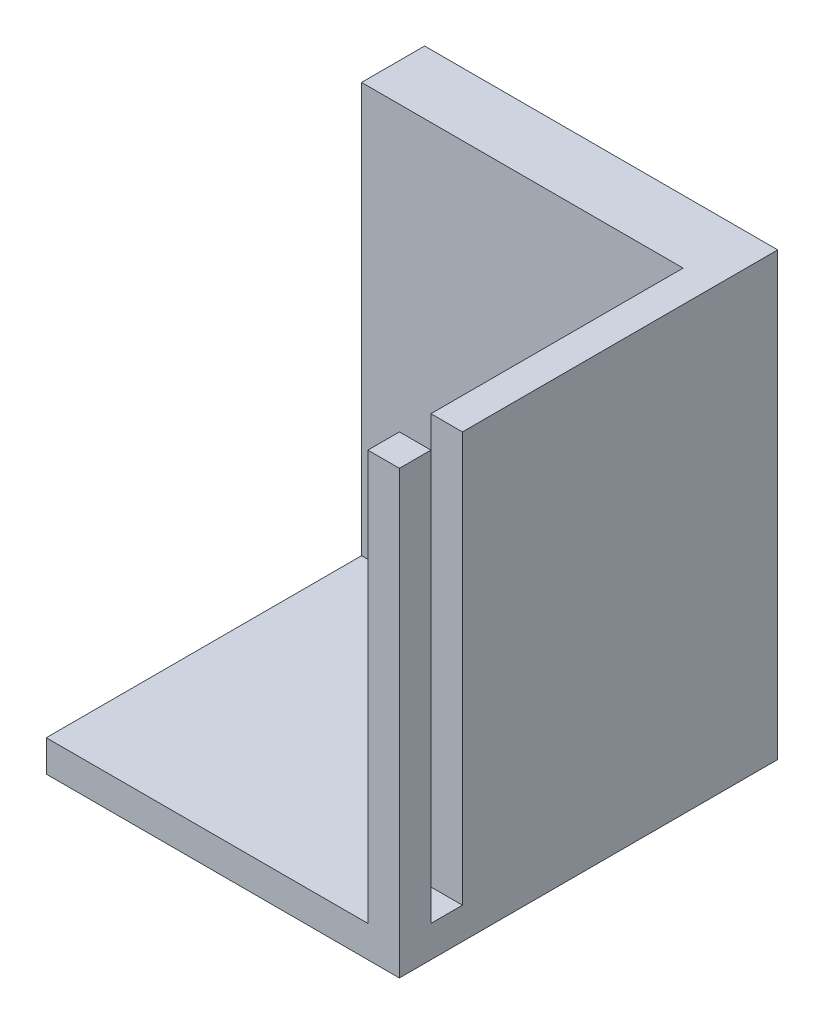
ISO-10303-21;
HEADER;
FILE_DESCRIPTION(('STEP AP214'),'2;1');
FILE_NAME('part.step','',(''),(''),'','','');
FILE_SCHEMA(('AUTOMOTIVE_DESIGN { 1 0 10303 214 1 1 1 1 }'));
ENDSEC;
DATA;
#1=APPLICATION_CONTEXT('core data for automotive mechanical design processes');
#2=APPLICATION_PROTOCOL_DEFINITION('international standard','automotive_design',2000,#1);
#3=PRODUCT_CONTEXT('',#1,'mechanical');
#4=PRODUCT('Part','Part','',(#3));
#5=PRODUCT_RELATED_PRODUCT_CATEGORY('part','',(#4));
#6=PRODUCT_DEFINITION_FORMATION('','',#4);
#7=PRODUCT_DEFINITION_CONTEXT('part definition',#1,'design');
#8=PRODUCT_DEFINITION('design','',#6,#7);
#9=PRODUCT_DEFINITION_SHAPE('','',#8);
#10=(LENGTH_UNIT() NAMED_UNIT(*) SI_UNIT(.MILLI.,.METRE.));
#11=(NAMED_UNIT(*) PLANE_ANGLE_UNIT() SI_UNIT($,.RADIAN.));
#12=(NAMED_UNIT(*) SI_UNIT($,.STERADIAN.) SOLID_ANGLE_UNIT());
#13=UNCERTAINTY_MEASURE_WITH_UNIT(LENGTH_MEASURE(1.E-05),#10,'distance_accuracy_value','');
#14=(GEOMETRIC_REPRESENTATION_CONTEXT(3) GLOBAL_UNCERTAINTY_ASSIGNED_CONTEXT((#13)) GLOBAL_UNIT_ASSIGNED_CONTEXT((#10,
#11,#12)) REPRESENTATION_CONTEXT('',''));
#15=CARTESIAN_POINT('',(0.,0.,0.));
#16=DIRECTION('',(0.,0.,1.));
#17=DIRECTION('',(1.,0.,0.));
#18=AXIS2_PLACEMENT_3D('',#15,#16,#17);
#19=CARTESIAN_POINT('',(0.,530.,0.));
#20=DIRECTION('',(0.,0.,-1.));
#21=DIRECTION('',(-1.,0.,0.));
#22=AXIS2_PLACEMENT_3D('',#19,#20,#21);
#23=PLANE('',#22);
#24=DIRECTION('',(0.,-1.,0.));
#25=VECTOR('',#24,1.);
#26=CARTESIAN_POINT('',(670.,530.,0.));
#27=LINE('',#26,#25);
#28=CARTESIAN_POINT('',(670.,140.,0.));
#29=VERTEX_POINT('',#28);
#30=CARTESIAN_POINT('',(670.,0.,0.));
#31=VERTEX_POINT('',#30);
#32=EDGE_CURVE('E11',#29,#31,#27,.T.);
#33=ORIENTED_EDGE('',*,*,#32,.F.);
#34=DIRECTION('',(-1.,0.,0.));
#35=VECTOR('',#34,1.);
#36=CARTESIAN_POINT('',(670.,140.,0.));
#37=LINE('',#36,#35);
#38=CARTESIAN_POINT('',(660.,140.,0.));
#39=VERTEX_POINT('',#38);
#40=EDGE_CURVE('E135',#29,#39,#37,.T.);
#41=ORIENTED_EDGE('',*,*,#40,.T.);
#42=DIRECTION('',(0.,1.,0.));
#43=VECTOR('',#42,1.);
#44=CARTESIAN_POINT('',(660.,10.,0.));
#45=LINE('',#44,#43);
#46=CARTESIAN_POINT('',(660.,10.,0.));
#47=VERTEX_POINT('',#46);
#48=EDGE_CURVE('E157',#47,#39,#45,.T.);
#49=ORIENTED_EDGE('',*,*,#48,.F.);
#50=DIRECTION('',(1.,0.,0.));
#51=VECTOR('',#50,1.);
#52=CARTESIAN_POINT('',(9.99999999999982,10.,0.));
#53=LINE('',#52,#51);
#54=CARTESIAN_POINT('',(558.,10.,0.));
#55=VERTEX_POINT('',#54);
#56=EDGE_CURVE('E162',#55,#47,#53,.T.);
#57=ORIENTED_EDGE('',*,*,#56,.F.);
#58=DIRECTION('',(0.,-1.,0.));
#59=VECTOR('',#58,1.);
#60=CARTESIAN_POINT('',(558.,0.,0.));
#61=LINE('',#60,#59);
#62=CARTESIAN_POINT('',(558.,0.,0.));
#63=VERTEX_POINT('',#62);
#64=EDGE_CURVE('E208',#55,#63,#61,.T.);
#65=ORIENTED_EDGE('',*,*,#64,.T.);
#66=DIRECTION('',(1.,0.,0.));
#67=VECTOR('',#66,1.);
#68=CARTESIAN_POINT('',(0.,0.,0.));
#69=LINE('',#68,#67);
#70=EDGE_CURVE('E148',#63,#31,#69,.T.);
#71=ORIENTED_EDGE('',*,*,#70,.T.);
#72=EDGE_LOOP('',(#33,#41,#49,#57,#65,#71));
#73=FACE_BOUND('',#72,.T.);
#74=ADVANCED_FACE('F38',(#73),#23,.F.);
#75=CARTESIAN_POINT('',(660.,10.,-100.));
#76=DIRECTION('',(1.,0.,0.));
#77=DIRECTION('',(0.,0.,-1.));
#78=AXIS2_PLACEMENT_3D('',#75,#76,#77);
#79=PLANE('',#78);
#80=ORIENTED_EDGE('',*,*,#48,.T.);
#81=DIRECTION('',(0.,0.,-1.));
#82=VECTOR('',#81,1.);
#83=CARTESIAN_POINT('',(660.,140.,-100.));
#84=LINE('',#83,#82);
#85=CARTESIAN_POINT('',(660.,140.,-10.));
#86=VERTEX_POINT('',#85);
#87=EDGE_CURVE('E222',#39,#86,#84,.T.);
#88=ORIENTED_EDGE('',*,*,#87,.T.);
#89=DIRECTION('',(0.,-1.,0.));
#90=VECTOR('',#89,1.);
#91=CARTESIAN_POINT('',(660.,10.,-9.99999999999999));
#92=LINE('',#91,#90);
#93=CARTESIAN_POINT('',(660.,10.,-10.));
#94=VERTEX_POINT('',#93);
#95=EDGE_CURVE('E165',#86,#94,#92,.T.);
#96=ORIENTED_EDGE('',*,*,#95,.T.);
#97=DIRECTION('',(0.,0.,1.));
#98=VECTOR('',#97,1.);
#99=CARTESIAN_POINT('',(660.,10.,-100.));
#100=LINE('',#99,#98);
#101=EDGE_CURVE('E156',#94,#47,#100,.T.);
#102=ORIENTED_EDGE('',*,*,#101,.T.);
#103=EDGE_LOOP('',(#80,#88,#96,#102));
#104=FACE_BOUND('',#103,.T.);
#105=ADVANCED_FACE('F268',(#104),#79,.F.);
#106=CARTESIAN_POINT('',(670.,530.,0.));
#107=DIRECTION('',(-1.,0.,0.));
#108=DIRECTION('',(0.,0.,1.));
#109=AXIS2_PLACEMENT_3D('',#106,#107,#108);
#110=PLANE('',#109);
#111=DIRECTION('',(0.,-1.,0.));
#112=VECTOR('',#111,1.);
#113=CARTESIAN_POINT('',(670.,530.,-120.));
#114=LINE('',#113,#112);
#115=CARTESIAN_POINT('',(670.,140.,-120.));
#116=VERTEX_POINT('',#115);
#117=CARTESIAN_POINT('',(670.,0.,-120.));
#118=VERTEX_POINT('',#117);
#119=EDGE_CURVE('E46',#116,#118,#114,.T.);
#120=ORIENTED_EDGE('',*,*,#119,.F.);
#121=DIRECTION('',(0.,0.,1.));
#122=VECTOR('',#121,1.);
#123=CARTESIAN_POINT('',(670.,140.,-120.));
#124=LINE('',#123,#122);
#125=CARTESIAN_POINT('',(670.,140.,-20.));
#126=VERTEX_POINT('',#125);
#127=EDGE_CURVE('E118',#116,#126,#124,.T.);
#128=ORIENTED_EDGE('',*,*,#127,.T.);
#129=DIRECTION('',(0.,1.,0.));
#130=VECTOR('',#129,1.);
#131=CARTESIAN_POINT('',(670.,10.,-20.));
#132=LINE('',#131,#130);
#133=CARTESIAN_POINT('',(670.,10.,-20.));
#134=VERTEX_POINT('',#133);
#135=EDGE_CURVE('E183',#134,#126,#132,.T.);
#136=ORIENTED_EDGE('',*,*,#135,.F.);
#137=DIRECTION('',(0.,0.,-1.));
#138=VECTOR('',#137,1.);
#139=CARTESIAN_POINT('',(670.,10.,-10.));
#140=LINE('',#139,#138);
#141=CARTESIAN_POINT('',(670.,10.,-10.));
#142=VERTEX_POINT('',#141);
#143=EDGE_CURVE('E188',#142,#134,#140,.T.);
#144=ORIENTED_EDGE('',*,*,#143,.F.);
#145=DIRECTION('',(0.,-1.,0.));
#146=VECTOR('',#145,1.);
#147=CARTESIAN_POINT('',(670.,10.,-10.));
#148=LINE('',#147,#146);
#149=CARTESIAN_POINT('',(670.,140.,-10.));
#150=VERTEX_POINT('',#149);
#151=EDGE_CURVE('E192',#150,#142,#148,.T.);
#152=ORIENTED_EDGE('',*,*,#151,.F.);
#153=EDGE_CURVE('E53',#150,#29,#124,.T.);
#154=ORIENTED_EDGE('',*,*,#153,.T.);
#155=ORIENTED_EDGE('',*,*,#32,.T.);
#156=DIRECTION('',(0.,0.,-1.));
#157=VECTOR('',#156,1.);
#158=CARTESIAN_POINT('',(670.,0.,0.));
#159=LINE('',#158,#157);
#160=EDGE_CURVE('E139',#31,#118,#159,.T.);
#161=ORIENTED_EDGE('',*,*,#160,.T.);
#162=EDGE_LOOP('',(#120,#128,#136,#144,#152,#154,#155,#161));
#163=FACE_BOUND('',#162,.T.);
#164=ADVANCED_FACE('F137',(#163),#110,.F.);
#165=CARTESIAN_POINT('',(0.,530.,-120.));
#166=DIRECTION('',(0.,0.,1.));
#167=DIRECTION('',(1.,0.,0.));
#168=AXIS2_PLACEMENT_3D('',#165,#166,#167);
#169=PLANE('',#168);
#170=DIRECTION('',(0.,1.,0.));
#171=VECTOR('',#170,1.);
#172=CARTESIAN_POINT('',(558.,530.,-120.));
#173=LINE('',#172,#171);
#174=CARTESIAN_POINT('',(558.,0.,-120.));
#175=VERTEX_POINT('',#174);
#176=CARTESIAN_POINT('',(558.,140.,-120.));
#177=VERTEX_POINT('',#176);
#178=EDGE_CURVE('E133',#175,#177,#173,.T.);
#179=ORIENTED_EDGE('',*,*,#178,.T.);
#180=DIRECTION('',(-1.,0.,0.));
#181=VECTOR('',#180,1.);
#182=CARTESIAN_POINT('',(670.,140.,-120.));
#183=LINE('',#182,#181);
#184=EDGE_CURVE('E61',#116,#177,#183,.T.);
#185=ORIENTED_EDGE('',*,*,#184,.F.);
#186=ORIENTED_EDGE('',*,*,#119,.T.);
#187=DIRECTION('',(-1.,0.,0.));
#188=VECTOR('',#187,1.);
#189=CARTESIAN_POINT('',(0.,0.,-120.));
#190=LINE('',#189,#188);
#191=EDGE_CURVE('E142',#118,#175,#190,.T.);
#192=ORIENTED_EDGE('',*,*,#191,.T.);
#193=EDGE_LOOP('',(#179,#185,#186,#192));
#194=FACE_BOUND('',#193,.T.);
#195=ADVANCED_FACE('F130',(#194),#169,.F.);
#196=CARTESIAN_POINT('',(0.,0.,0.));
#197=DIRECTION('',(0.,-1.,0.));
#198=DIRECTION('',(0.,0.,-1.));
#199=AXIS2_PLACEMENT_3D('',#196,#197,#198);
#200=PLANE('',#199);
#201=DIRECTION('',(0.,0.,-1.));
#202=VECTOR('',#201,1.);
#203=CARTESIAN_POINT('',(558.,0.,0.));
#204=LINE('',#203,#202);
#205=EDGE_CURVE('E204',#63,#175,#204,.T.);
#206=ORIENTED_EDGE('',*,*,#205,.T.);
#207=ORIENTED_EDGE('',*,*,#191,.F.);
#208=ORIENTED_EDGE('',*,*,#160,.F.);
#209=ORIENTED_EDGE('',*,*,#70,.F.);
#210=EDGE_LOOP('',(#206,#207,#208,#209));
#211=FACE_BOUND('',#210,.T.);
#212=ADVANCED_FACE('F243',(#211),#200,.T.);
#213=DIRECTION('',(0.,1.,0.));
#214=VECTOR('',#213,1.);
#215=CARTESIAN_POINT('',(660.,10.,-20.));
#216=LINE('',#215,#214);
#217=CARTESIAN_POINT('',(660.,10.,-20.));
#218=VERTEX_POINT('',#217);
#219=CARTESIAN_POINT('',(660.,140.,-20.));
#220=VERTEX_POINT('',#219);
#221=EDGE_CURVE('E174',#218,#220,#216,.T.);
#222=ORIENTED_EDGE('',*,*,#221,.T.);
#223=DIRECTION('',(0.,0.,-1.));
#224=VECTOR('',#223,1.);
#225=CARTESIAN_POINT('',(660.,140.,-100.));
#226=LINE('',#225,#224);
#227=CARTESIAN_POINT('',(660.,140.,-100.));
#228=VERTEX_POINT('',#227);
#229=EDGE_CURVE('E216',#220,#228,#226,.T.);
#230=ORIENTED_EDGE('',*,*,#229,.T.);
#231=DIRECTION('',(0.,1.,0.));
#232=VECTOR('',#231,1.);
#233=CARTESIAN_POINT('',(660.,10.,-100.));
#234=LINE('',#233,#232);
#235=CARTESIAN_POINT('',(660.,10.,-100.));
#236=VERTEX_POINT('',#235);
#237=EDGE_CURVE('E166',#236,#228,#234,.T.);
#238=ORIENTED_EDGE('',*,*,#237,.F.);
#239=EDGE_CURVE('E152',#236,#218,#100,.T.);
#240=ORIENTED_EDGE('',*,*,#239,.T.);
#241=EDGE_LOOP('',(#222,#230,#238,#240));
#242=FACE_BOUND('',#241,.T.);
#243=ADVANCED_FACE('F254',(#242),#79,.F.);
#244=CARTESIAN_POINT('',(9.99999999999982,10.,-100.));
#245=DIRECTION('',(0.,-1.,0.));
#246=DIRECTION('',(0.,0.,-1.));
#247=AXIS2_PLACEMENT_3D('',#244,#245,#246);
#248=PLANE('',#247);
#249=DIRECTION('',(1.,0.,0.));
#250=VECTOR('',#249,1.);
#251=CARTESIAN_POINT('',(9.99999999999982,10.,-100.));
#252=LINE('',#251,#250);
#253=CARTESIAN_POINT('',(558.,10.,-100.));
#254=VERTEX_POINT('',#253);
#255=EDGE_CURVE('E161',#254,#236,#252,.T.);
#256=ORIENTED_EDGE('',*,*,#255,.F.);
#257=DIRECTION('',(0.,0.,1.));
#258=VECTOR('',#257,1.);
#259=CARTESIAN_POINT('',(558.,10.,-100.));
#260=LINE('',#259,#258);
#261=EDGE_CURVE('E197',#254,#55,#260,.T.);
#262=ORIENTED_EDGE('',*,*,#261,.T.);
#263=ORIENTED_EDGE('',*,*,#56,.T.);
#264=ORIENTED_EDGE('',*,*,#101,.F.);
#265=DIRECTION('',(1.,0.,0.));
#266=VECTOR('',#265,1.);
#267=CARTESIAN_POINT('',(-47.0000000000002,10.,-10.));
#268=LINE('',#267,#266);
#269=EDGE_CURVE('E179',#94,#142,#268,.T.);
#270=ORIENTED_EDGE('',*,*,#269,.T.);
#271=ORIENTED_EDGE('',*,*,#143,.T.);
#272=DIRECTION('',(1.,0.,0.));
#273=VECTOR('',#272,1.);
#274=CARTESIAN_POINT('',(-47.0000000000002,10.,-20.));
#275=LINE('',#274,#273);
#276=EDGE_CURVE('E178',#218,#134,#275,.T.);
#277=ORIENTED_EDGE('',*,*,#276,.F.);
#278=ORIENTED_EDGE('',*,*,#239,.F.);
#279=EDGE_LOOP('',(#256,#262,#263,#264,#270,#271,#277,#278));
#280=FACE_BOUND('',#279,.T.);
#281=ADVANCED_FACE('F259',(#280),#248,.F.);
#282=CARTESIAN_POINT('',(0.,0.,-100.));
#283=DIRECTION('',(0.,0.,-1.));
#284=DIRECTION('',(-1.,0.,0.));
#285=AXIS2_PLACEMENT_3D('',#282,#283,#284);
#286=PLANE('',#285);
#287=ORIENTED_EDGE('',*,*,#237,.T.);
#288=DIRECTION('',(-1.,0.,0.));
#289=VECTOR('',#288,1.);
#290=CARTESIAN_POINT('',(0.,140.,-100.));
#291=LINE('',#290,#289);
#292=CARTESIAN_POINT('',(558.,140.,-100.));
#293=VERTEX_POINT('',#292);
#294=EDGE_CURVE('E212',#228,#293,#291,.T.);
#295=ORIENTED_EDGE('',*,*,#294,.T.);
#296=DIRECTION('',(0.,-1.,0.));
#297=VECTOR('',#296,1.);
#298=CARTESIAN_POINT('',(558.,0.,-100.));
#299=LINE('',#298,#297);
#300=EDGE_CURVE('E201',#293,#254,#299,.T.);
#301=ORIENTED_EDGE('',*,*,#300,.T.);
#302=ORIENTED_EDGE('',*,*,#255,.T.);
#303=EDGE_LOOP('',(#287,#295,#301,#302));
#304=FACE_BOUND('',#303,.T.);
#305=ADVANCED_FACE('F250',(#304),#286,.F.);
#306=CARTESIAN_POINT('',(-47.0000000000002,10.,-20.));
#307=DIRECTION('',(0.,0.,-1.));
#308=DIRECTION('',(-1.,0.,0.));
#309=AXIS2_PLACEMENT_3D('',#306,#307,#308);
#310=PLANE('',#309);
#311=ORIENTED_EDGE('',*,*,#135,.T.);
#312=DIRECTION('',(-1.,0.,0.));
#313=VECTOR('',#312,1.);
#314=CARTESIAN_POINT('',(-47.0000000000002,140.,-20.));
#315=LINE('',#314,#313);
#316=EDGE_CURVE('E121',#126,#220,#315,.T.);
#317=ORIENTED_EDGE('',*,*,#316,.T.);
#318=ORIENTED_EDGE('',*,*,#221,.F.);
#319=ORIENTED_EDGE('',*,*,#276,.T.);
#320=EDGE_LOOP('',(#311,#317,#318,#319));
#321=FACE_BOUND('',#320,.T.);
#322=ADVANCED_FACE('F257',(#321),#310,.F.);
#323=CARTESIAN_POINT('',(-47.0000000000002,10.,-10.));
#324=DIRECTION('',(0.,0.,1.));
#325=DIRECTION('',(1.,0.,0.));
#326=AXIS2_PLACEMENT_3D('',#323,#324,#325);
#327=PLANE('',#326);
#328=ORIENTED_EDGE('',*,*,#95,.F.);
#329=DIRECTION('',(1.,0.,0.));
#330=VECTOR('',#329,1.);
#331=CARTESIAN_POINT('',(-47.0000000000002,140.,-10.));
#332=LINE('',#331,#330);
#333=EDGE_CURVE('E226',#86,#150,#332,.T.);
#334=ORIENTED_EDGE('',*,*,#333,.T.);
#335=ORIENTED_EDGE('',*,*,#151,.T.);
#336=ORIENTED_EDGE('',*,*,#269,.F.);
#337=EDGE_LOOP('',(#328,#334,#335,#336));
#338=FACE_BOUND('',#337,.T.);
#339=ADVANCED_FACE('F265',(#338),#327,.F.);
#340=CARTESIAN_POINT('',(558.,0.,0.));
#341=DIRECTION('',(1.,0.,0.));
#342=DIRECTION('',(0.,0.,-1.));
#343=AXIS2_PLACEMENT_3D('',#340,#341,#342);
#344=PLANE('',#343);
#345=ORIENTED_EDGE('',*,*,#300,.F.);
#346=DIRECTION('',(0.,0.,1.));
#347=VECTOR('',#346,1.);
#348=CARTESIAN_POINT('',(558.,140.,-120.));
#349=LINE('',#348,#347);
#350=EDGE_CURVE('E232',#177,#293,#349,.T.);
#351=ORIENTED_EDGE('',*,*,#350,.F.);
#352=ORIENTED_EDGE('',*,*,#178,.F.);
#353=ORIENTED_EDGE('',*,*,#205,.F.);
#354=ORIENTED_EDGE('',*,*,#64,.F.);
#355=ORIENTED_EDGE('',*,*,#261,.F.);
#356=EDGE_LOOP('',(#345,#351,#352,#353,#354,#355));
#357=FACE_BOUND('',#356,.T.);
#358=ADVANCED_FACE('F246',(#357),#344,.F.);
#359=CARTESIAN_POINT('',(670.,140.,-120.));
#360=DIRECTION('',(0.,-1.,0.));
#361=DIRECTION('',(0.,0.,-1.));
#362=AXIS2_PLACEMENT_3D('',#359,#360,#361);
#363=PLANE('',#362);
#364=ORIENTED_EDGE('',*,*,#229,.F.);
#365=ORIENTED_EDGE('',*,*,#316,.F.);
#366=ORIENTED_EDGE('',*,*,#127,.F.);
#367=ORIENTED_EDGE('',*,*,#184,.T.);
#368=ORIENTED_EDGE('',*,*,#350,.T.);
#369=ORIENTED_EDGE('',*,*,#294,.F.);
#370=EDGE_LOOP('',(#364,#365,#366,#367,#368,#369));
#371=FACE_BOUND('',#370,.T.);
#372=ADVANCED_FACE('F119',(#371),#363,.F.);
#373=ORIENTED_EDGE('',*,*,#40,.F.);
#374=ORIENTED_EDGE('',*,*,#153,.F.);
#375=ORIENTED_EDGE('',*,*,#333,.F.);
#376=ORIENTED_EDGE('',*,*,#87,.F.);
#377=EDGE_LOOP('',(#373,#374,#375,#376));
#378=FACE_BOUND('',#377,.T.);
#379=ADVANCED_FACE('F266',(#378),#363,.F.);
#380=CLOSED_SHELL('',(#74,#105,#164,#195,#212,#243,#281,#305,#322,#339,#358,#372,#379));
#381=MANIFOLD_SOLID_BREP('B2',#380);
#382=ADVANCED_BREP_SHAPE_REPRESENTATION('',(#18,#381),#14);
#383=SHAPE_DEFINITION_REPRESENTATION(#9,#382);
ENDSEC;
END-ISO-10303-21;
